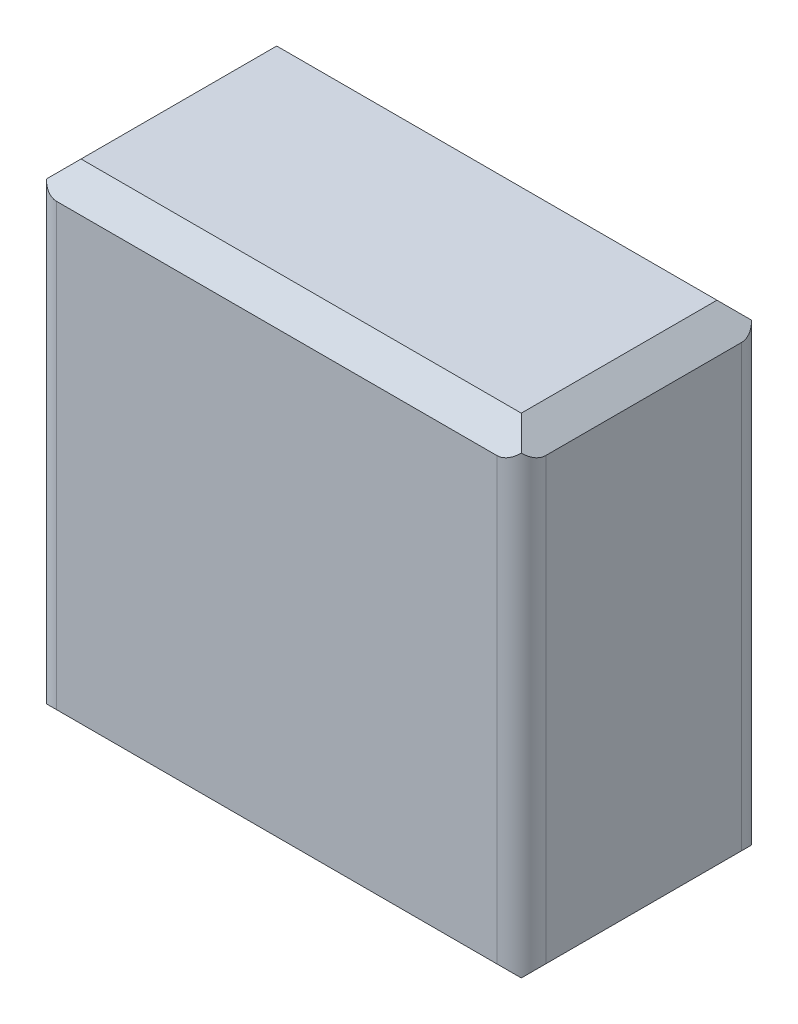
ISO-10303-21;
HEADER;
FILE_DESCRIPTION(('STEP AP214'),'2;1');
FILE_NAME('part.step','',(''),(''),'','','');
FILE_SCHEMA(('AUTOMOTIVE_DESIGN { 1 0 10303 214 1 1 1 1 }'));
ENDSEC;
DATA;
#1=APPLICATION_CONTEXT('core data for automotive mechanical design processes');
#2=APPLICATION_PROTOCOL_DEFINITION('international standard','automotive_design',2000,#1);
#3=PRODUCT_CONTEXT('',#1,'mechanical');
#4=PRODUCT('Part','Part','',(#3));
#5=PRODUCT_RELATED_PRODUCT_CATEGORY('part','',(#4));
#6=PRODUCT_DEFINITION_FORMATION('','',#4);
#7=PRODUCT_DEFINITION_CONTEXT('part definition',#1,'design');
#8=PRODUCT_DEFINITION('design','',#6,#7);
#9=PRODUCT_DEFINITION_SHAPE('','',#8);
#10=(LENGTH_UNIT() NAMED_UNIT(*) SI_UNIT(.MILLI.,.METRE.));
#11=(NAMED_UNIT(*) PLANE_ANGLE_UNIT() SI_UNIT($,.RADIAN.));
#12=(NAMED_UNIT(*) SI_UNIT($,.STERADIAN.) SOLID_ANGLE_UNIT());
#13=UNCERTAINTY_MEASURE_WITH_UNIT(LENGTH_MEASURE(1.E-05),#10,'distance_accuracy_value','');
#14=(GEOMETRIC_REPRESENTATION_CONTEXT(3) GLOBAL_UNCERTAINTY_ASSIGNED_CONTEXT((#13)) GLOBAL_UNIT_ASSIGNED_CONTEXT((#10,
#11,#12)) REPRESENTATION_CONTEXT('',''));
#15=CARTESIAN_POINT('',(0.,0.,0.));
#16=DIRECTION('',(0.,0.,1.));
#17=DIRECTION('',(1.,0.,0.));
#18=AXIS2_PLACEMENT_3D('',#15,#16,#17);
#19=CARTESIAN_POINT('',(-28.7360979260819,40.4282429798151,20.));
#20=DIRECTION('',(0.,1.,0.));
#21=DIRECTION('',(0.,0.,1.));
#22=AXIS2_PLACEMENT_3D('',#19,#20,#21);
#23=PLANE('',#22);
#24=DIRECTION('',(1.,0.,0.));
#25=VECTOR('',#24,1.);
#26=CARTESIAN_POINT('',(11.2639020739181,40.4282429798151,18.));
#27=LINE('',#26,#25);
#28=CARTESIAN_POINT('',(-26.7360979260819,40.4282429798151,18.));
#29=VERTEX_POINT('',#28);
#30=CARTESIAN_POINT('',(9.26390207391807,40.4282429798151,18.));
#31=VERTEX_POINT('',#30);
#32=EDGE_CURVE('E159',#29,#31,#27,.T.);
#33=ORIENTED_EDGE('',*,*,#32,.T.);
#34=DIRECTION('',(0.,0.,-1.));
#35=VECTOR('',#34,1.);
#36=CARTESIAN_POINT('',(9.26390207391807,40.4282429798151,20.));
#37=LINE('',#36,#35);
#38=CARTESIAN_POINT('',(9.26390207391807,40.4282429798151,2.00000000000001));
#39=VERTEX_POINT('',#38);
#40=EDGE_CURVE('E183',#31,#39,#37,.T.);
#41=ORIENTED_EDGE('',*,*,#40,.T.);
#42=DIRECTION('',(-1.,0.,0.));
#43=VECTOR('',#42,1.);
#44=CARTESIAN_POINT('',(-28.7360979260819,40.4282429798151,2.00000000000001));
#45=LINE('',#44,#43);
#46=CARTESIAN_POINT('',(-26.7360979260819,40.4282429798151,2.00000000000001));
#47=VERTEX_POINT('',#46);
#48=EDGE_CURVE('E162',#39,#47,#45,.T.);
#49=ORIENTED_EDGE('',*,*,#48,.T.);
#50=DIRECTION('',(0.,0.,1.));
#51=VECTOR('',#50,1.);
#52=CARTESIAN_POINT('',(-26.7360979260819,40.4282429798151,20.));
#53=LINE('',#52,#51);
#54=EDGE_CURVE('E155',#47,#29,#53,.T.);
#55=ORIENTED_EDGE('',*,*,#54,.T.);
#56=EDGE_LOOP('',(#33,#41,#49,#55));
#57=FACE_BOUND('',#56,.T.);
#58=ADVANCED_FACE('F42',(#57),#23,.T.);
#59=CARTESIAN_POINT('',(-28.7360979260819,40.4282429798151,20.));
#60=DIRECTION('',(1.,0.,0.));
#61=DIRECTION('',(0.,1.,0.));
#62=AXIS2_PLACEMENT_3D('',#59,#60,#61);
#63=PLANE('',#62);
#64=DIRECTION('',(0.,0.,1.));
#65=VECTOR('',#64,1.);
#66=CARTESIAN_POINT('',(-28.7360979260819,2.42824297981507,20.));
#67=LINE('',#66,#65);
#68=CARTESIAN_POINT('',(-28.7360979260819,2.42824297981507,2.));
#69=VERTEX_POINT('',#68);
#70=CARTESIAN_POINT('',(-28.7360979260819,2.42824297981507,18.));
#71=VERTEX_POINT('',#70);
#72=EDGE_CURVE('E220',#69,#71,#67,.T.);
#73=ORIENTED_EDGE('',*,*,#72,.T.);
#74=DIRECTION('',(0.,-1.,0.));
#75=VECTOR('',#74,1.);
#76=CARTESIAN_POINT('',(-28.7360979260819,40.4282429798151,18.));
#77=LINE('',#76,#75);
#78=CARTESIAN_POINT('',(-28.7360979260819,38.4282429798151,18.));
#79=VERTEX_POINT('',#78);
#80=EDGE_CURVE('E63',#71,#79,#77,.F.);
#81=ORIENTED_EDGE('',*,*,#80,.T.);
#82=DIRECTION('',(0.,0.,-1.));
#83=VECTOR('',#82,1.);
#84=CARTESIAN_POINT('',(-28.7360979260819,38.4282429798151,0.));
#85=LINE('',#84,#83);
#86=CARTESIAN_POINT('',(-28.7360979260819,38.4282429798151,2.));
#87=VERTEX_POINT('',#86);
#88=EDGE_CURVE('E191',#79,#87,#85,.T.);
#89=ORIENTED_EDGE('',*,*,#88,.T.);
#90=DIRECTION('',(0.,-1.,0.));
#91=VECTOR('',#90,1.);
#92=CARTESIAN_POINT('',(-28.7360979260819,2.42824297981507,2.));
#93=LINE('',#92,#91);
#94=EDGE_CURVE('E279',#87,#69,#93,.T.);
#95=ORIENTED_EDGE('',*,*,#94,.T.);
#96=EDGE_LOOP('',(#73,#81,#89,#95));
#97=FACE_BOUND('',#96,.T.);
#98=ADVANCED_FACE('F284',(#97),#63,.F.);
#99=CARTESIAN_POINT('',(-28.7360979260819,0.428242979815065,20.));
#100=DIRECTION('',(0.,1.,0.));
#101=DIRECTION('',(0.,0.,1.));
#102=AXIS2_PLACEMENT_3D('',#99,#100,#101);
#103=PLANE('',#102);
#104=DIRECTION('',(1.,0.,0.));
#105=VECTOR('',#104,1.);
#106=CARTESIAN_POINT('',(11.2639020739181,0.428242979815065,2.));
#107=LINE('',#106,#105);
#108=CARTESIAN_POINT('',(-26.7360979260819,0.428242979815065,2.));
#109=VERTEX_POINT('',#108);
#110=CARTESIAN_POINT('',(9.26390207391809,0.428242979815065,2.));
#111=VERTEX_POINT('',#110);
#112=EDGE_CURVE('E212',#109,#111,#107,.T.);
#113=ORIENTED_EDGE('',*,*,#112,.T.);
#114=DIRECTION('',(0.,0.,1.));
#115=VECTOR('',#114,1.);
#116=CARTESIAN_POINT('',(9.26390207391809,0.428242979815065,20.));
#117=LINE('',#116,#115);
#118=CARTESIAN_POINT('',(9.26390207391809,0.428242979815065,18.));
#119=VERTEX_POINT('',#118);
#120=EDGE_CURVE('E214',#111,#119,#117,.T.);
#121=ORIENTED_EDGE('',*,*,#120,.T.);
#122=DIRECTION('',(-1.,0.,0.));
#123=VECTOR('',#122,1.);
#124=CARTESIAN_POINT('',(-28.7360979260819,0.428242979815065,18.));
#125=LINE('',#124,#123);
#126=CARTESIAN_POINT('',(-26.7360979260819,0.428242979815065,18.));
#127=VERTEX_POINT('',#126);
#128=EDGE_CURVE('E207',#119,#127,#125,.T.);
#129=ORIENTED_EDGE('',*,*,#128,.T.);
#130=DIRECTION('',(0.,0.,-1.));
#131=VECTOR('',#130,1.);
#132=CARTESIAN_POINT('',(-26.7360979260819,0.428242979815065,20.));
#133=LINE('',#132,#131);
#134=EDGE_CURVE('E210',#127,#109,#133,.T.);
#135=ORIENTED_EDGE('',*,*,#134,.T.);
#136=EDGE_LOOP('',(#113,#121,#129,#135));
#137=FACE_BOUND('',#136,.T.);
#138=CARTESIAN_POINT('',(-18.7360979260819,0.428242979815065,10.));
#139=DIRECTION('',(0.,1.,0.));
#140=DIRECTION('',(0.,0.,1.));
#141=AXIS2_PLACEMENT_3D('',#138,#139,#140);
#142=CIRCLE('',#141,5.);
#143=CARTESIAN_POINT('',(-18.7360979260819,0.428242979815065,15.));
#144=VERTEX_POINT('',#143);
#145=EDGE_CURVE('E196',#144,#144,#142,.F.);
#146=ORIENTED_EDGE('',*,*,#145,.F.);
#147=EDGE_LOOP('',(#146));
#148=FACE_BOUND('',#147,.T.);
#149=ADVANCED_FACE('F330',(#137,#148),#103,.F.);
#150=CARTESIAN_POINT('',(11.2639020739181,40.4282429798151,20.));
#151=DIRECTION('',(1.,0.,0.));
#152=DIRECTION('',(0.,1.,0.));
#153=AXIS2_PLACEMENT_3D('',#150,#151,#152);
#154=PLANE('',#153);
#155=DIRECTION('',(0.,0.,-1.));
#156=VECTOR('',#155,1.);
#157=CARTESIAN_POINT('',(11.2639020739181,2.42824297981507,0.));
#158=LINE('',#157,#156);
#159=CARTESIAN_POINT('',(11.2639020739181,2.42824297981507,18.));
#160=VERTEX_POINT('',#159);
#161=CARTESIAN_POINT('',(11.2639020739181,2.42824297981507,2.));
#162=VERTEX_POINT('',#161);
#163=EDGE_CURVE('E204',#160,#162,#158,.T.);
#164=ORIENTED_EDGE('',*,*,#163,.T.);
#165=DIRECTION('',(0.,-1.,0.));
#166=VECTOR('',#165,1.);
#167=CARTESIAN_POINT('',(11.2639020739181,40.4282429798151,2.));
#168=LINE('',#167,#166);
#169=CARTESIAN_POINT('',(11.2639020739181,38.4282429798151,2.));
#170=VERTEX_POINT('',#169);
#171=EDGE_CURVE('E252',#162,#170,#168,.F.);
#172=ORIENTED_EDGE('',*,*,#171,.T.);
#173=DIRECTION('',(0.,0.,1.));
#174=VECTOR('',#173,1.);
#175=CARTESIAN_POINT('',(11.2639020739181,38.4282429798151,20.));
#176=LINE('',#175,#174);
#177=CARTESIAN_POINT('',(11.2639020739181,38.4282429798151,18.));
#178=VERTEX_POINT('',#177);
#179=EDGE_CURVE('E185',#170,#178,#176,.T.);
#180=ORIENTED_EDGE('',*,*,#179,.T.);
#181=DIRECTION('',(0.,-1.,0.));
#182=VECTOR('',#181,1.);
#183=CARTESIAN_POINT('',(11.2639020739181,2.42824297981507,18.));
#184=LINE('',#183,#182);
#185=EDGE_CURVE('E249',#178,#160,#184,.T.);
#186=ORIENTED_EDGE('',*,*,#185,.T.);
#187=EDGE_LOOP('',(#164,#172,#180,#186));
#188=FACE_BOUND('',#187,.T.);
#189=ADVANCED_FACE('F341',(#188),#154,.T.);
#190=CARTESIAN_POINT('',(0.,0.,20.));
#191=DIRECTION('',(0.,0.,-1.));
#192=DIRECTION('',(-1.,0.,0.));
#193=AXIS2_PLACEMENT_3D('',#190,#191,#192);
#194=PLANE('',#193);
#195=DIRECTION('',(1.,0.,0.));
#196=VECTOR('',#195,1.);
#197=CARTESIAN_POINT('',(0.,2.42824297981507,20.));
#198=LINE('',#197,#196);
#199=CARTESIAN_POINT('',(-26.7360979260819,2.42824297981507,20.));
#200=VERTEX_POINT('',#199);
#201=CARTESIAN_POINT('',(9.26390207391809,2.42824297981507,20.));
#202=VERTEX_POINT('',#201);
#203=EDGE_CURVE('E222',#200,#202,#198,.T.);
#204=ORIENTED_EDGE('',*,*,#203,.T.);
#205=DIRECTION('',(0.,-1.,0.));
#206=VECTOR('',#205,1.);
#207=CARTESIAN_POINT('',(9.26390207391808,38.4282429798151,20.));
#208=LINE('',#207,#206);
#209=CARTESIAN_POINT('',(9.26390207391808,38.4282429798151,20.));
#210=VERTEX_POINT('',#209);
#211=EDGE_CURVE('E269',#202,#210,#208,.F.);
#212=ORIENTED_EDGE('',*,*,#211,.T.);
#213=DIRECTION('',(-1.,0.,0.));
#214=VECTOR('',#213,1.);
#215=CARTESIAN_POINT('',(-28.7360979260819,38.4282429798151,20.));
#216=LINE('',#215,#214);
#217=CARTESIAN_POINT('',(-26.7360979260819,38.4282429798151,20.));
#218=VERTEX_POINT('',#217);
#219=EDGE_CURVE('E193',#210,#218,#216,.T.);
#220=ORIENTED_EDGE('',*,*,#219,.T.);
#221=DIRECTION('',(0.,-1.,0.));
#222=VECTOR('',#221,1.);
#223=CARTESIAN_POINT('',(-26.7360979260819,0.,20.));
#224=LINE('',#223,#222);
#225=EDGE_CURVE('E266',#218,#200,#224,.T.);
#226=ORIENTED_EDGE('',*,*,#225,.T.);
#227=EDGE_LOOP('',(#204,#212,#220,#226));
#228=FACE_BOUND('',#227,.T.);
#229=ADVANCED_FACE('F297',(#228),#194,.F.);
#230=CARTESIAN_POINT('',(0.,0.,0.));
#231=DIRECTION('',(0.,0.,-1.));
#232=DIRECTION('',(-1.,0.,0.));
#233=AXIS2_PLACEMENT_3D('',#230,#231,#232);
#234=PLANE('',#233);
#235=DIRECTION('',(1.,0.,0.));
#236=VECTOR('',#235,1.);
#237=CARTESIAN_POINT('',(0.,38.4282429798151,0.));
#238=LINE('',#237,#236);
#239=CARTESIAN_POINT('',(-26.7360979260819,38.4282429798151,0.));
#240=VERTEX_POINT('',#239);
#241=CARTESIAN_POINT('',(9.26390207391808,38.4282429798151,0.));
#242=VERTEX_POINT('',#241);
#243=EDGE_CURVE('E188',#240,#242,#238,.T.);
#244=ORIENTED_EDGE('',*,*,#243,.T.);
#245=DIRECTION('',(0.,-1.,0.));
#246=VECTOR('',#245,1.);
#247=CARTESIAN_POINT('',(9.26390207391809,0.,0.));
#248=LINE('',#247,#246);
#249=CARTESIAN_POINT('',(9.26390207391809,2.42824297981507,0.));
#250=VERTEX_POINT('',#249);
#251=EDGE_CURVE('E238',#242,#250,#248,.T.);
#252=ORIENTED_EDGE('',*,*,#251,.T.);
#253=DIRECTION('',(-1.,0.,0.));
#254=VECTOR('',#253,1.);
#255=CARTESIAN_POINT('',(-28.7360979260819,2.42824297981507,0.));
#256=LINE('',#255,#254);
#257=CARTESIAN_POINT('',(-26.7360979260819,2.42824297981507,0.));
#258=VERTEX_POINT('',#257);
#259=EDGE_CURVE('E217',#250,#258,#256,.T.);
#260=ORIENTED_EDGE('',*,*,#259,.T.);
#261=DIRECTION('',(0.,-1.,0.));
#262=VECTOR('',#261,1.);
#263=CARTESIAN_POINT('',(-26.7360979260819,38.4282429798151,0.));
#264=LINE('',#263,#262);
#265=EDGE_CURVE('E225',#258,#240,#264,.F.);
#266=ORIENTED_EDGE('',*,*,#265,.T.);
#267=EDGE_LOOP('',(#244,#252,#260,#266));
#268=FACE_BOUND('',#267,.T.);
#269=ADVANCED_FACE('F318',(#268),#234,.T.);
#270=CARTESIAN_POINT('',(-28.7360979260819,38.4282429798151,20.));
#271=DIRECTION('',(-0.707106781186549,0.707106781186546,0.));
#272=DIRECTION('',(0.,0.,1.));
#273=AXIS2_PLACEMENT_3D('',#270,#271,#272);
#274=PLANE('',#273);
#275=ORIENTED_EDGE('',*,*,#88,.F.);
#276=CARTESIAN_POINT('',(-26.7360979260819,40.4282429798151,18.));
#277=DIRECTION('',(-0.707106781186549,0.707106781186546,0.));
#278=DIRECTION('',(-0.707106781186546,-0.707106781186549,0.));
#279=AXIS2_PLACEMENT_3D('',#276,#277,#278);
#280=ELLIPSE('',#279,2.82842712474619,2.);
#281=CARTESIAN_POINT('',(-28.150311488455,39.014029417442,19.4142135623731));
#282=VERTEX_POINT('',#281);
#283=EDGE_CURVE('E11',#79,#282,#280,.T.);
#284=ORIENTED_EDGE('',*,*,#283,.T.);
#285=DIRECTION('',(-0.577350269189625,-0.577350269189627,0.577350269189625));
#286=VECTOR('',#285,1.);
#287=CARTESIAN_POINT('',(-27.4027645927486,39.7615763131484,18.6666666666667));
#288=LINE('',#287,#286);
#289=EDGE_CURVE('E165',#29,#282,#288,.T.);
#290=ORIENTED_EDGE('',*,*,#289,.F.);
#291=ORIENTED_EDGE('',*,*,#54,.F.);
#292=DIRECTION('',(0.577350269189625,0.577350269189627,0.577350269189625));
#293=VECTOR('',#292,1.);
#294=CARTESIAN_POINT('',(-22.0694312594153,45.0949096464817,6.66666666666665));
#295=LINE('',#294,#293);
#296=CARTESIAN_POINT('',(-28.150311488455,39.014029417442,0.585786437626902));
#297=VERTEX_POINT('',#296);
#298=EDGE_CURVE('E170',#297,#47,#295,.T.);
#299=ORIENTED_EDGE('',*,*,#298,.F.);
#300=CARTESIAN_POINT('',(-26.7360979260819,40.4282429798151,2.));
#301=DIRECTION('',(-0.707106781186549,0.707106781186546,0.));
#302=DIRECTION('',(0.707106781186546,0.707106781186549,0.));
#303=AXIS2_PLACEMENT_3D('',#300,#301,#302);
#304=ELLIPSE('',#303,2.82842712474619,2.);
#305=EDGE_CURVE('E50',#297,#87,#304,.T.);
#306=ORIENTED_EDGE('',*,*,#305,.T.);
#307=EDGE_LOOP('',(#275,#284,#290,#291,#299,#306));
#308=FACE_BOUND('',#307,.T.);
#309=ADVANCED_FACE('F166',(#308),#274,.T.);
#310=CARTESIAN_POINT('',(-28.7360979260819,40.4282429798151,18.));
#311=DIRECTION('',(0.,0.707106781186546,0.707106781186549));
#312=DIRECTION('',(-1.,0.,0.));
#313=AXIS2_PLACEMENT_3D('',#310,#311,#312);
#314=PLANE('',#313);
#315=ORIENTED_EDGE('',*,*,#219,.F.);
#316=CARTESIAN_POINT('',(9.26390207391808,40.4282429798151,18.));
#317=DIRECTION('',(0.,0.707106781186546,0.707106781186549));
#318=DIRECTION('',(0.,0.707106781186549,-0.707106781186546));
#319=AXIS2_PLACEMENT_3D('',#316,#317,#318);
#320=ELLIPSE('',#319,2.82842712474619,2.);
#321=CARTESIAN_POINT('',(10.6781156362912,39.0140294174419,19.4142135623731));
#322=VERTEX_POINT('',#321);
#323=EDGE_CURVE('E273',#210,#322,#320,.T.);
#324=ORIENTED_EDGE('',*,*,#323,.T.);
#325=DIRECTION('',(0.577350269189625,-0.577350269189627,0.577350269189625));
#326=VECTOR('',#325,1.);
#327=CARTESIAN_POINT('',(-3.40276459274856,53.0949096464817,5.33333333333336));
#328=LINE('',#327,#326);
#329=EDGE_CURVE('E175',#31,#322,#328,.T.);
#330=ORIENTED_EDGE('',*,*,#329,.F.);
#331=ORIENTED_EDGE('',*,*,#32,.F.);
#332=ORIENTED_EDGE('',*,*,#289,.T.);
#333=CARTESIAN_POINT('',(-26.7360979260819,40.4282429798151,18.));
#334=DIRECTION('',(0.,0.707106781186546,0.707106781186549));
#335=DIRECTION('',(0.,-0.707106781186549,0.707106781186546));
#336=AXIS2_PLACEMENT_3D('',#333,#334,#335);
#337=ELLIPSE('',#336,2.82842712474619,2.);
#338=EDGE_CURVE('E271',#282,#218,#337,.T.);
#339=ORIENTED_EDGE('',*,*,#338,.T.);
#340=EDGE_LOOP('',(#315,#324,#330,#331,#332,#339));
#341=FACE_BOUND('',#340,.T.);
#342=ADVANCED_FACE('F173',(#341),#314,.T.);
#343=CARTESIAN_POINT('',(0.,38.4282429798151,0.));
#344=DIRECTION('',(0.,-0.707106781186546,0.707106781186549));
#345=DIRECTION('',(1.,0.,0.));
#346=AXIS2_PLACEMENT_3D('',#343,#344,#345);
#347=PLANE('',#346);
#348=DIRECTION('',(0.577350269189625,-0.577350269189627,-0.577350269189625));
#349=VECTOR('',#348,1.);
#350=CARTESIAN_POINT('',(7.50926804927873,42.1828770044544,3.75463402463935));
#351=LINE('',#350,#349);
#352=CARTESIAN_POINT('',(10.6781156362912,39.014029417442,0.585786437626907));
#353=VERTEX_POINT('',#352);
#354=EDGE_CURVE('E197',#353,#39,#351,.F.);
#355=ORIENTED_EDGE('',*,*,#354,.F.);
#356=CARTESIAN_POINT('',(9.26390207391808,40.4282429798151,2.));
#357=DIRECTION('',(0.,-0.707106781186546,0.707106781186549));
#358=DIRECTION('',(0.,-0.707106781186549,-0.707106781186546));
#359=AXIS2_PLACEMENT_3D('',#356,#357,#358);
#360=ELLIPSE('',#359,2.82842712474619,2.);
#361=EDGE_CURVE('E260',#353,#242,#360,.F.);
#362=ORIENTED_EDGE('',*,*,#361,.T.);
#363=ORIENTED_EDGE('',*,*,#243,.F.);
#364=CARTESIAN_POINT('',(-26.7360979260819,40.4282429798151,2.));
#365=DIRECTION('',(0.,-0.707106781186546,0.707106781186549));
#366=DIRECTION('',(0.,0.707106781186549,0.707106781186546));
#367=AXIS2_PLACEMENT_3D('',#364,#365,#366);
#368=ELLIPSE('',#367,2.82842712474619,2.);
#369=EDGE_CURVE('E258',#240,#297,#368,.F.);
#370=ORIENTED_EDGE('',*,*,#369,.T.);
#371=ORIENTED_EDGE('',*,*,#298,.T.);
#372=ORIENTED_EDGE('',*,*,#48,.F.);
#373=EDGE_LOOP('',(#355,#362,#363,#370,#371,#372));
#374=FACE_BOUND('',#373,.T.);
#375=ADVANCED_FACE('F312',(#374),#347,.F.);
#376=CARTESIAN_POINT('',(9.26390207391807,40.4282429798151,20.));
#377=DIRECTION('',(-0.707106781186549,-0.707106781186546,0.));
#378=DIRECTION('',(0.,0.,-1.));
#379=AXIS2_PLACEMENT_3D('',#376,#377,#378);
#380=PLANE('',#379);
#381=ORIENTED_EDGE('',*,*,#179,.F.);
#382=CARTESIAN_POINT('',(9.26390207391808,40.4282429798151,2.));
#383=DIRECTION('',(-0.707106781186549,-0.707106781186546,0.));
#384=DIRECTION('',(0.707106781186546,-0.707106781186549,0.));
#385=AXIS2_PLACEMENT_3D('',#382,#383,#384);
#386=ELLIPSE('',#385,2.8284271247462,2.);
#387=EDGE_CURVE('E256',#170,#353,#386,.F.);
#388=ORIENTED_EDGE('',*,*,#387,.T.);
#389=ORIENTED_EDGE('',*,*,#354,.T.);
#390=ORIENTED_EDGE('',*,*,#40,.F.);
#391=ORIENTED_EDGE('',*,*,#329,.T.);
#392=CARTESIAN_POINT('',(9.26390207391808,40.4282429798151,18.));
#393=DIRECTION('',(-0.707106781186549,-0.707106781186546,0.));
#394=DIRECTION('',(-0.707106781186546,0.707106781186549,0.));
#395=AXIS2_PLACEMENT_3D('',#392,#393,#394);
#396=ELLIPSE('',#395,2.8284271247462,2.);
#397=EDGE_CURVE('E254',#322,#178,#396,.F.);
#398=ORIENTED_EDGE('',*,*,#397,.T.);
#399=EDGE_LOOP('',(#381,#388,#389,#390,#391,#398));
#400=FACE_BOUND('',#399,.T.);
#401=ADVANCED_FACE('F307',(#400),#380,.F.);
#402=CARTESIAN_POINT('',(-18.7360979260819,-1.57175702018494,10.));
#403=DIRECTION('',(0.,1.,0.));
#404=DIRECTION('',(0.,0.,1.));
#405=AXIS2_PLACEMENT_3D('',#402,#403,#404);
#406=CYLINDRICAL_SURFACE('',#405,5.);
#407=CARTESIAN_POINT('',(-18.7360979260819,-1.57175702018494,10.));
#408=DIRECTION('',(0.,-1.,0.));
#409=DIRECTION('',(0.,0.,-1.));
#410=AXIS2_PLACEMENT_3D('',#407,#408,#409);
#411=CIRCLE('',#410,5.);
#412=CARTESIAN_POINT('',(-18.7360979260819,-1.57175702018494,5.));
#413=VERTEX_POINT('',#412);
#414=EDGE_CURVE('E179',#413,#413,#411,.T.);
#415=ORIENTED_EDGE('',*,*,#414,.F.);
#416=EDGE_LOOP('',(#415));
#417=FACE_BOUND('',#416,.T.);
#418=ORIENTED_EDGE('',*,*,#145,.T.);
#419=EDGE_LOOP('',(#418));
#420=FACE_BOUND('',#419,.T.);
#421=ADVANCED_FACE('F365',(#417,#420),#406,.T.);
#422=CARTESIAN_POINT('',(-18.7360979260819,-1.57175702018494,10.));
#423=DIRECTION('',(0.,-1.,0.));
#424=DIRECTION('',(0.,0.,-1.));
#425=AXIS2_PLACEMENT_3D('',#422,#423,#424);
#426=PLANE('',#425);
#427=CARTESIAN_POINT('',(-18.7360979260819,-1.57175702018494,10.));
#428=DIRECTION('',(0.,-1.,0.));
#429=DIRECTION('',(0.,0.,-1.));
#430=AXIS2_PLACEMENT_3D('',#427,#428,#429);
#431=CIRCLE('',#430,2.5);
#432=CARTESIAN_POINT('',(-18.7360979260819,-1.57175702018494,7.5));
#433=VERTEX_POINT('',#432);
#434=EDGE_CURVE('E203',#433,#433,#431,.T.);
#435=ORIENTED_EDGE('',*,*,#434,.F.);
#436=EDGE_LOOP('',(#435));
#437=FACE_BOUND('',#436,.T.);
#438=ORIENTED_EDGE('',*,*,#414,.T.);
#439=EDGE_LOOP('',(#438));
#440=FACE_BOUND('',#439,.T.);
#441=ADVANCED_FACE('F508',(#437,#440),#426,.T.);
#442=CARTESIAN_POINT('',(-18.7360979260819,-4.57175702018494,10.));
#443=DIRECTION('',(0.,1.,0.));
#444=DIRECTION('',(0.,0.,1.));
#445=AXIS2_PLACEMENT_3D('',#442,#443,#444);
#446=CYLINDRICAL_SURFACE('',#445,2.5);
#447=CARTESIAN_POINT('',(-18.7360979260819,-4.57175702018494,10.));
#448=DIRECTION('',(0.,-1.,0.));
#449=DIRECTION('',(0.,0.,-1.));
#450=AXIS2_PLACEMENT_3D('',#447,#448,#449);
#451=CIRCLE('',#450,2.5);
#452=CARTESIAN_POINT('',(-18.7360979260819,-4.57175702018494,7.5));
#453=VERTEX_POINT('',#452);
#454=EDGE_CURVE('E236',#453,#453,#451,.T.);
#455=ORIENTED_EDGE('',*,*,#454,.F.);
#456=EDGE_LOOP('',(#455));
#457=FACE_BOUND('',#456,.T.);
#458=ORIENTED_EDGE('',*,*,#434,.T.);
#459=EDGE_LOOP('',(#458));
#460=FACE_BOUND('',#459,.T.);
#461=ADVANCED_FACE('F518',(#457,#460),#446,.T.);
#462=CARTESIAN_POINT('',(-18.7360979260819,-4.57175702018494,10.));
#463=DIRECTION('',(0.,-1.,0.));
#464=DIRECTION('',(0.,0.,-1.));
#465=AXIS2_PLACEMENT_3D('',#462,#463,#464);
#466=PLANE('',#465);
#467=ORIENTED_EDGE('',*,*,#454,.T.);
#468=EDGE_LOOP('',(#467));
#469=FACE_BOUND('',#468,.T.);
#470=ADVANCED_FACE('F399',(#469),#466,.T.);
#471=CARTESIAN_POINT('',(-26.7360979260819,0.428242979815065,20.));
#472=DIRECTION('',(0.707106781186547,0.707106781186547,0.));
#473=DIRECTION('',(0.,0.,-1.));
#474=AXIS2_PLACEMENT_3D('',#471,#472,#473);
#475=PLANE('',#474);
#476=DIRECTION('',(0.577350269189626,-0.577350269189626,-0.577350269189626));
#477=VECTOR('',#476,1.);
#478=CARTESIAN_POINT('',(-19.1573986173879,-7.15045632887891,10.421300691306));
#479=LINE('',#478,#477);
#480=CARTESIAN_POINT('',(-28.150311488455,1.84245654218815,19.4142135623731));
#481=VERTEX_POINT('',#480);
#482=EDGE_CURVE('E234',#481,#127,#479,.T.);
#483=ORIENTED_EDGE('',*,*,#482,.F.);
#484=CARTESIAN_POINT('',(-26.7360979260819,0.428242979815068,18.));
#485=DIRECTION('',(0.707106781186547,0.707106781186547,0.));
#486=DIRECTION('',(0.707106781186548,-0.707106781186548,0.));
#487=AXIS2_PLACEMENT_3D('',#484,#485,#486);
#488=ELLIPSE('',#487,2.82842712474619,2.);
#489=EDGE_CURVE('E277',#481,#71,#488,.F.);
#490=ORIENTED_EDGE('',*,*,#489,.T.);
#491=ORIENTED_EDGE('',*,*,#72,.F.);
#492=CARTESIAN_POINT('',(-26.7360979260819,0.428242979815065,2.));
#493=DIRECTION('',(0.707106781186547,0.707106781186547,0.));
#494=DIRECTION('',(-0.707106781186548,0.707106781186548,0.));
#495=AXIS2_PLACEMENT_3D('',#492,#493,#494);
#496=ELLIPSE('',#495,2.82842712474619,2.);
#497=CARTESIAN_POINT('',(-28.150311488455,1.84245654218816,0.585786437626904));
#498=VERTEX_POINT('',#497);
#499=EDGE_CURVE('E275',#69,#498,#496,.F.);
#500=ORIENTED_EDGE('',*,*,#499,.T.);
#501=DIRECTION('',(-0.577350269189626,0.577350269189626,-0.577350269189626));
#502=VECTOR('',#501,1.);
#503=CARTESIAN_POINT('',(-20.7360979260819,-5.57175702018494,8.));
#504=LINE('',#503,#502);
#505=EDGE_CURVE('E231',#109,#498,#504,.T.);
#506=ORIENTED_EDGE('',*,*,#505,.F.);
#507=ORIENTED_EDGE('',*,*,#134,.F.);
#508=EDGE_LOOP('',(#483,#490,#491,#500,#506,#507));
#509=FACE_BOUND('',#508,.T.);
#510=ADVANCED_FACE('F288',(#509),#475,.F.);
#511=CARTESIAN_POINT('',(0.,2.42824297981507,20.));
#512=DIRECTION('',(0.,0.707106781186547,-0.707106781186547));
#513=DIRECTION('',(1.,0.,0.));
#514=AXIS2_PLACEMENT_3D('',#511,#512,#513);
#515=PLANE('',#514);
#516=DIRECTION('',(-0.577350269189626,-0.577350269189626,-0.577350269189626));
#517=VECTOR('',#516,1.);
#518=CARTESIAN_POINT('',(7.50926804927873,-1.3263910448243,16.2453659753606));
#519=LINE('',#518,#517);
#520=CARTESIAN_POINT('',(10.6781156362912,1.84245654218816,19.4142135623731));
#521=VERTEX_POINT('',#520);
#522=EDGE_CURVE('E229',#521,#119,#519,.T.);
#523=ORIENTED_EDGE('',*,*,#522,.F.);
#524=CARTESIAN_POINT('',(9.26390207391809,0.428242979815065,18.));
#525=DIRECTION('',(0.,0.707106781186547,-0.707106781186547));
#526=DIRECTION('',(0.,0.707106781186548,0.707106781186548));
#527=AXIS2_PLACEMENT_3D('',#524,#525,#526);
#528=ELLIPSE('',#527,2.82842712474619,2.);
#529=EDGE_CURVE('E264',#521,#202,#528,.F.);
#530=ORIENTED_EDGE('',*,*,#529,.T.);
#531=ORIENTED_EDGE('',*,*,#203,.F.);
#532=CARTESIAN_POINT('',(-26.7360979260819,0.428242979815068,18.));
#533=DIRECTION('',(0.,0.707106781186547,-0.707106781186547));
#534=DIRECTION('',(0.,-0.707106781186548,-0.707106781186548));
#535=AXIS2_PLACEMENT_3D('',#532,#533,#534);
#536=ELLIPSE('',#535,2.82842712474619,2.);
#537=EDGE_CURVE('E262',#200,#481,#536,.F.);
#538=ORIENTED_EDGE('',*,*,#537,.T.);
#539=ORIENTED_EDGE('',*,*,#482,.T.);
#540=ORIENTED_EDGE('',*,*,#128,.F.);
#541=EDGE_LOOP('',(#523,#530,#531,#538,#539,#540));
#542=FACE_BOUND('',#541,.T.);
#543=ADVANCED_FACE('F336',(#542),#515,.F.);
#544=CARTESIAN_POINT('',(-28.7360979260819,0.428242979815065,2.));
#545=DIRECTION('',(0.,-0.707106781186547,-0.707106781186547));
#546=DIRECTION('',(-1.,0.,0.));
#547=AXIS2_PLACEMENT_3D('',#544,#545,#546);
#548=PLANE('',#547);
#549=ORIENTED_EDGE('',*,*,#259,.F.);
#550=CARTESIAN_POINT('',(9.26390207391809,0.428242979815066,2.));
#551=DIRECTION('',(0.,-0.707106781186547,-0.707106781186547));
#552=DIRECTION('',(0.,-0.707106781186548,0.707106781186548));
#553=AXIS2_PLACEMENT_3D('',#550,#551,#552);
#554=ELLIPSE('',#553,2.82842712474619,2.);
#555=CARTESIAN_POINT('',(10.6781156362912,1.84245654218816,0.585786437626908));
#556=VERTEX_POINT('',#555);
#557=EDGE_CURVE('E243',#250,#556,#554,.T.);
#558=ORIENTED_EDGE('',*,*,#557,.T.);
#559=DIRECTION('',(-0.577350269189626,-0.577350269189626,0.577350269189626));
#560=VECTOR('',#559,1.);
#561=CARTESIAN_POINT('',(-3.40276459274858,-12.2384236868516,14.6666666666667));
#562=LINE('',#561,#560);
#563=EDGE_CURVE('E226',#111,#556,#562,.F.);
#564=ORIENTED_EDGE('',*,*,#563,.F.);
#565=ORIENTED_EDGE('',*,*,#112,.F.);
#566=ORIENTED_EDGE('',*,*,#505,.T.);
#567=CARTESIAN_POINT('',(-26.7360979260819,0.428242979815072,2.));
#568=DIRECTION('',(0.,-0.707106781186547,-0.707106781186547));
#569=DIRECTION('',(0.,0.707106781186548,-0.707106781186548));
#570=AXIS2_PLACEMENT_3D('',#567,#568,#569);
#571=ELLIPSE('',#570,2.82842712474619,2.);
#572=EDGE_CURVE('E241',#498,#258,#571,.T.);
#573=ORIENTED_EDGE('',*,*,#572,.T.);
#574=EDGE_LOOP('',(#549,#558,#564,#565,#566,#573));
#575=FACE_BOUND('',#574,.T.);
#576=ADVANCED_FACE('F326',(#575),#548,.T.);
#577=CARTESIAN_POINT('',(11.2639020739181,2.42824297981507,20.));
#578=DIRECTION('',(0.707106781186547,-0.707106781186547,0.));
#579=DIRECTION('',(0.,0.,1.));
#580=AXIS2_PLACEMENT_3D('',#577,#578,#579);
#581=PLANE('',#580);
#582=ORIENTED_EDGE('',*,*,#563,.T.);
#583=CARTESIAN_POINT('',(9.26390207391809,0.428242979815066,2.));
#584=DIRECTION('',(0.707106781186547,-0.707106781186547,0.));
#585=DIRECTION('',(-0.707106781186548,-0.707106781186548,0.));
#586=AXIS2_PLACEMENT_3D('',#583,#584,#585);
#587=ELLIPSE('',#586,2.82842712474619,2.);
#588=EDGE_CURVE('E247',#556,#162,#587,.T.);
#589=ORIENTED_EDGE('',*,*,#588,.T.);
#590=ORIENTED_EDGE('',*,*,#163,.F.);
#591=CARTESIAN_POINT('',(9.26390207391809,0.428242979815065,18.));
#592=DIRECTION('',(0.707106781186547,-0.707106781186547,0.));
#593=DIRECTION('',(0.707106781186548,0.707106781186548,0.));
#594=AXIS2_PLACEMENT_3D('',#591,#592,#593);
#595=ELLIPSE('',#594,2.82842712474619,2.);
#596=EDGE_CURVE('E245',#160,#521,#595,.T.);
#597=ORIENTED_EDGE('',*,*,#596,.T.);
#598=ORIENTED_EDGE('',*,*,#522,.T.);
#599=ORIENTED_EDGE('',*,*,#120,.F.);
#600=EDGE_LOOP('',(#582,#589,#590,#597,#598,#599));
#601=FACE_BOUND('',#600,.T.);
#602=ADVANCED_FACE('F338',(#601),#581,.T.);
#603=CARTESIAN_POINT('',(9.26390207391809,0.,2.));
#604=DIRECTION('',(0.,-1.,0.));
#605=DIRECTION('',(1.,0.,0.));
#606=AXIS2_PLACEMENT_3D('',#603,#604,#605);
#607=CYLINDRICAL_SURFACE('',#606,2.);
#608=ORIENTED_EDGE('',*,*,#387,.F.);
#609=ORIENTED_EDGE('',*,*,#171,.F.);
#610=ORIENTED_EDGE('',*,*,#588,.F.);
#611=ORIENTED_EDGE('',*,*,#557,.F.);
#612=ORIENTED_EDGE('',*,*,#251,.F.);
#613=ORIENTED_EDGE('',*,*,#361,.F.);
#614=EDGE_LOOP('',(#608,#609,#610,#611,#612,#613));
#615=FACE_BOUND('',#614,.T.);
#616=ADVANCED_FACE('F322',(#615),#607,.T.);
#617=CARTESIAN_POINT('',(9.26390207391808,40.4282429798151,18.));
#618=DIRECTION('',(0.,1.,0.));
#619=DIRECTION('',(-1.,0.,0.));
#620=AXIS2_PLACEMENT_3D('',#617,#618,#619);
#621=CYLINDRICAL_SURFACE('',#620,2.);
#622=ORIENTED_EDGE('',*,*,#323,.F.);
#623=ORIENTED_EDGE('',*,*,#211,.F.);
#624=ORIENTED_EDGE('',*,*,#529,.F.);
#625=ORIENTED_EDGE('',*,*,#596,.F.);
#626=ORIENTED_EDGE('',*,*,#185,.F.);
#627=ORIENTED_EDGE('',*,*,#397,.F.);
#628=EDGE_LOOP('',(#622,#623,#624,#625,#626,#627));
#629=FACE_BOUND('',#628,.T.);
#630=ADVANCED_FACE('F302',(#629),#621,.T.);
#631=CARTESIAN_POINT('',(-26.7360979260819,0.,18.));
#632=DIRECTION('',(0.,-1.,0.));
#633=DIRECTION('',(1.,0.,0.));
#634=AXIS2_PLACEMENT_3D('',#631,#632,#633);
#635=CYLINDRICAL_SURFACE('',#634,2.);
#636=ORIENTED_EDGE('',*,*,#283,.F.);
#637=ORIENTED_EDGE('',*,*,#80,.F.);
#638=ORIENTED_EDGE('',*,*,#489,.F.);
#639=ORIENTED_EDGE('',*,*,#537,.F.);
#640=ORIENTED_EDGE('',*,*,#225,.F.);
#641=ORIENTED_EDGE('',*,*,#338,.F.);
#642=EDGE_LOOP('',(#636,#637,#638,#639,#640,#641));
#643=FACE_BOUND('',#642,.T.);
#644=ADVANCED_FACE('F293',(#643),#635,.T.);
#645=CARTESIAN_POINT('',(-26.7360979260819,40.4282429798151,2.));
#646=DIRECTION('',(0.,1.,0.));
#647=DIRECTION('',(-1.,0.,0.));
#648=AXIS2_PLACEMENT_3D('',#645,#646,#647);
#649=CYLINDRICAL_SURFACE('',#648,2.);
#650=ORIENTED_EDGE('',*,*,#369,.F.);
#651=ORIENTED_EDGE('',*,*,#265,.F.);
#652=ORIENTED_EDGE('',*,*,#572,.F.);
#653=ORIENTED_EDGE('',*,*,#499,.F.);
#654=ORIENTED_EDGE('',*,*,#94,.F.);
#655=ORIENTED_EDGE('',*,*,#305,.F.);
#656=EDGE_LOOP('',(#650,#651,#652,#653,#654,#655));
#657=FACE_BOUND('',#656,.T.);
#658=ADVANCED_FACE('F44',(#657),#649,.T.);
#659=CLOSED_SHELL('',(#58,#98,#149,#189,#229,#269,#309,#342,#375,#401,#421,#441,#461,#470,#510,
#543,#576,#602,#616,#630,#644,#658));
#660=MANIFOLD_SOLID_BREP('B2',#659);
#661=ADVANCED_BREP_SHAPE_REPRESENTATION('',(#18,#660),#14);
#662=SHAPE_DEFINITION_REPRESENTATION(#9,#661);
ENDSEC;
END-ISO-10303-21;
